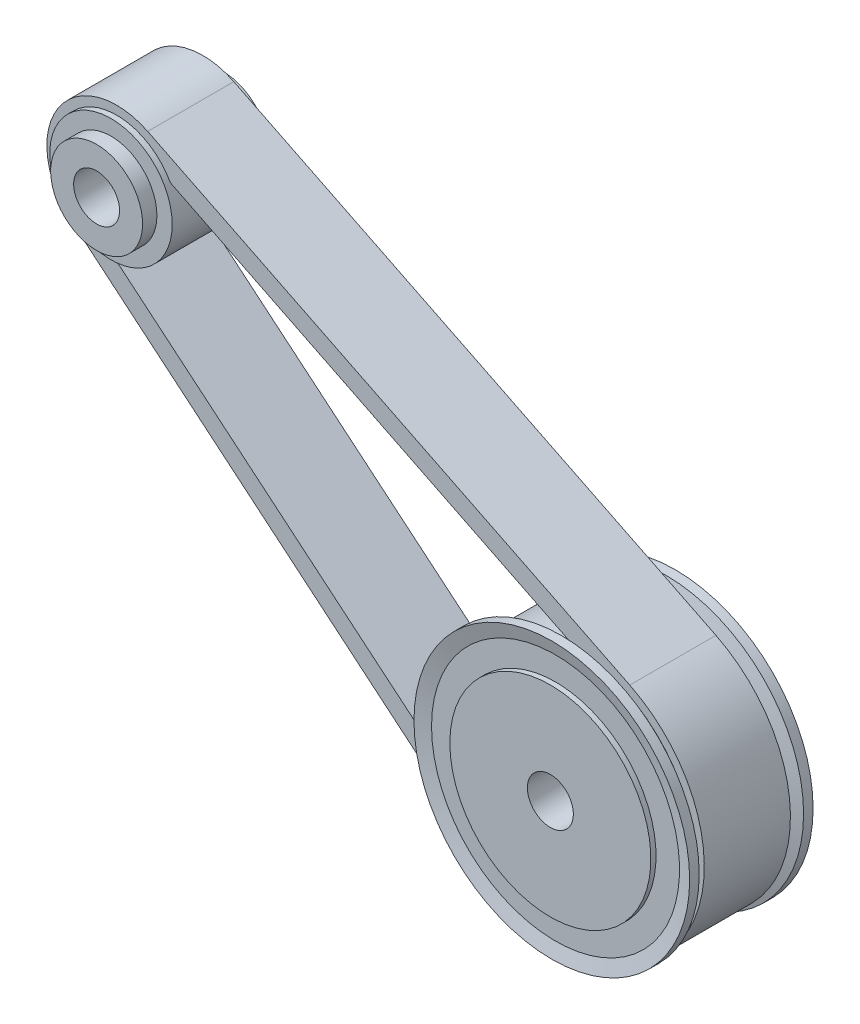
ISO-10303-21;
HEADER;
FILE_DESCRIPTION(('STEP AP214'),'2;1');
FILE_NAME('part.step','',(''),(''),'','','');
FILE_SCHEMA(('AUTOMOTIVE_DESIGN { 1 0 10303 214 1 1 1 1 }'));
ENDSEC;
DATA;
#1=APPLICATION_CONTEXT('core data for automotive mechanical design processes');
#2=APPLICATION_PROTOCOL_DEFINITION('international standard','automotive_design',2000,#1);
#3=PRODUCT_CONTEXT('',#1,'mechanical');
#4=PRODUCT('Part','Part','',(#3));
#5=PRODUCT_RELATED_PRODUCT_CATEGORY('part','',(#4));
#6=PRODUCT_DEFINITION_FORMATION('','',#4);
#7=PRODUCT_DEFINITION_CONTEXT('part definition',#1,'design');
#8=PRODUCT_DEFINITION('design','',#6,#7);
#9=PRODUCT_DEFINITION_SHAPE('','',#8);
#10=(LENGTH_UNIT() NAMED_UNIT(*) SI_UNIT(.MILLI.,.METRE.));
#11=(NAMED_UNIT(*) PLANE_ANGLE_UNIT() SI_UNIT($,.RADIAN.));
#12=(NAMED_UNIT(*) SI_UNIT($,.STERADIAN.) SOLID_ANGLE_UNIT());
#13=UNCERTAINTY_MEASURE_WITH_UNIT(LENGTH_MEASURE(1.E-05),#10,'distance_accuracy_value','');
#14=(GEOMETRIC_REPRESENTATION_CONTEXT(3) GLOBAL_UNCERTAINTY_ASSIGNED_CONTEXT((#13)) GLOBAL_UNIT_ASSIGNED_CONTEXT((#10,
#11,#12)) REPRESENTATION_CONTEXT('',''));
#15=CARTESIAN_POINT('',(0.,0.,0.));
#16=DIRECTION('',(0.,0.,1.));
#17=DIRECTION('',(1.,0.,0.));
#18=AXIS2_PLACEMENT_3D('',#15,#16,#17);
#19=CARTESIAN_POINT('',(-79.,51.5,-3.5));
#20=DIRECTION('',(0.,0.,1.));
#21=DIRECTION('',(1.,0.,0.));
#22=AXIS2_PLACEMENT_3D('',#19,#20,#21);
#23=PLANE('',#22);
#24=CARTESIAN_POINT('',(-79.,51.5,-3.5));
#25=DIRECTION('',(0.,0.,1.));
#26=DIRECTION('',(1.,0.,0.));
#27=AXIS2_PLACEMENT_3D('',#24,#25,#26);
#28=CIRCLE('',#27,12.16);
#29=CARTESIAN_POINT('',(-73.6091780465663,62.3997540644905,-3.5));
#30=VERTEX_POINT('',#29);
#31=CARTESIAN_POINT('',(-86.7974853442076,42.1691467535456,-3.5));
#32=VERTEX_POINT('',#31);
#33=EDGE_CURVE('E138',#30,#32,#28,.T.);
#34=ORIENTED_EDGE('',*,*,#33,.T.);
#35=DIRECTION('',(0.767339905136049,-0.641240571069703,0.));
#36=VECTOR('',#35,1.);
#37=CARTESIAN_POINT('',(-86.7974853442076,42.1691467535456,-3.5));
#38=LINE('',#37,#36);
#39=CARTESIAN_POINT('',(-14.9409053059241,-17.87901978967,-3.5));
#40=VERTEX_POINT('',#39);
#41=EDGE_CURVE('E141',#32,#40,#38,.T.);
#42=ORIENTED_EDGE('',*,*,#41,.T.);
#43=CARTESIAN_POINT('',(0.,0.,-3.5));
#44=DIRECTION('',(0.,0.,1.));
#45=DIRECTION('',(1.,0.,0.));
#46=AXIS2_PLACEMENT_3D('',#43,#44,#45);
#47=CIRCLE('',#46,23.3);
#48=CARTESIAN_POINT('',(10.3294532495892,20.8852195479136,-3.5));
#49=VERTEX_POINT('',#48);
#50=EDGE_CURVE('E143',#40,#49,#47,.T.);
#51=ORIENTED_EDGE('',*,*,#50,.T.);
#52=DIRECTION('',(-0.896361353987706,0.443324173802112,0.));
#53=VECTOR('',#52,1.);
#54=CARTESIAN_POINT('',(10.3294532495892,20.8852195479136,-3.5));
#55=LINE('',#54,#53);
#56=EDGE_CURVE('E145',#49,#30,#55,.T.);
#57=ORIENTED_EDGE('',*,*,#56,.T.);
#58=EDGE_LOOP('',(#34,#42,#51,#57));
#59=FACE_BOUND('',#58,.T.);
#60=DIRECTION('',(0.767339905136049,-0.641240571069703,0.));
#61=VECTOR('',#60,1.);
#62=CARTESIAN_POINT('',(-84.6108549968599,44.7857758300596,-3.5));
#63=LINE('',#62,#61);
#64=CARTESIAN_POINT('',(-79.9387000700333,40.8814105372456,-3.5));
#65=VERTEX_POINT('',#64);
#66=CARTESIAN_POINT('',(-19.6015916595124,-9.54031469154621,-3.5));
#67=VERTEX_POINT('',#66);
#68=EDGE_CURVE('E135',#65,#67,#63,.T.);
#69=ORIENTED_EDGE('',*,*,#68,.F.);
#70=CARTESIAN_POINT('',(-79.,51.5,-3.5));
#71=DIRECTION('',(0.,0.,1.));
#72=DIRECTION('',(1.,0.,0.));
#73=AXIS2_PLACEMENT_3D('',#70,#71,#72);
#74=CIRCLE('',#73,10.66);
#75=CARTESIAN_POINT('',(-69.6631768383774,56.6438636498829,-3.5));
#76=VERTEX_POINT('',#75);
#77=EDGE_CURVE('E55',#65,#76,#74,.F.);
#78=ORIENTED_EDGE('',*,*,#77,.T.);
#79=DIRECTION('',(-0.896361353987707,0.443324173802112,0.));
#80=VECTOR('',#79,1.);
#81=CARTESIAN_POINT('',(8.81771781692401,17.8286273308155,-3.5));
#82=LINE('',#81,#80);
#83=CARTESIAN_POINT('',(0.81908510128873,21.7846069415275,-3.5));
#84=VERTEX_POINT('',#83);
#85=EDGE_CURVE('E113',#84,#76,#82,.T.);
#86=ORIENTED_EDGE('',*,*,#85,.F.);
#87=CARTESIAN_POINT('',(0.,0.,-3.5));
#88=DIRECTION('',(0.,0.,1.));
#89=DIRECTION('',(1.,0.,0.));
#90=AXIS2_PLACEMENT_3D('',#87,#88,#89);
#91=CIRCLE('',#90,21.8);
#92=EDGE_CURVE('E41',#67,#84,#91,.T.);
#93=ORIENTED_EDGE('',*,*,#92,.F.);
#94=EDGE_LOOP('',(#69,#78,#86,#93));
#95=FACE_BOUND('',#94,.T.);
#96=ADVANCED_FACE('F33',(#59,#95),#23,.T.);
#97=CARTESIAN_POINT('',(-84.6108549968599,44.7857758300596,-3.5));
#98=DIRECTION('',(0.641240571069703,0.767339905136049,0.));
#99=DIRECTION('',(-0.767339905136049,0.641240571069703,0.));
#100=AXIS2_PLACEMENT_3D('',#97,#98,#99);
#101=PLANE('',#100);
#102=DIRECTION('',(0.767339905136049,-0.641240571069703,0.));
#103=VECTOR('',#102,1.);
#104=CARTESIAN_POINT('',(-84.6108549968599,44.7857758300596,-18.5));
#105=LINE('',#104,#103);
#106=CARTESIAN_POINT('',(-79.9387000700333,40.8814105372456,-18.5));
#107=VERTEX_POINT('',#106);
#108=CARTESIAN_POINT('',(-19.6015916595124,-9.54031469154621,-18.5));
#109=VERTEX_POINT('',#108);
#110=EDGE_CURVE('E108',#107,#109,#105,.T.);
#111=ORIENTED_EDGE('',*,*,#110,.F.);
#112=DIRECTION('',(0.,0.,1.));
#113=VECTOR('',#112,1.);
#114=CARTESIAN_POINT('',(-79.9387000700333,40.8814105372456,-50.));
#115=LINE('',#114,#113);
#116=EDGE_CURVE('E48',#107,#65,#115,.T.);
#117=ORIENTED_EDGE('',*,*,#116,.T.);
#118=ORIENTED_EDGE('',*,*,#68,.T.);
#119=DIRECTION('',(0.,0.,-1.));
#120=VECTOR('',#119,1.);
#121=CARTESIAN_POINT('',(-19.6015916595124,-9.54031469154621,50.));
#122=LINE('',#121,#120);
#123=EDGE_CURVE('E200',#109,#67,#122,.F.);
#124=ORIENTED_EDGE('',*,*,#123,.F.);
#125=EDGE_LOOP('',(#111,#117,#118,#124));
#126=FACE_BOUND('',#125,.T.);
#127=ADVANCED_FACE('F208',(#126),#101,.T.);
#128=CARTESIAN_POINT('',(8.81771781692401,17.8286273308155,-3.5));
#129=DIRECTION('',(-0.443324173802112,-0.896361353987706,0.));
#130=DIRECTION('',(0.896361353987707,-0.443324173802112,0.));
#131=AXIS2_PLACEMENT_3D('',#128,#129,#130);
#132=PLANE('',#131);
#133=ORIENTED_EDGE('',*,*,#85,.T.);
#134=DIRECTION('',(0.,0.,1.));
#135=VECTOR('',#134,1.);
#136=CARTESIAN_POINT('',(-69.6631768383773,56.6438636498829,-50.));
#137=LINE('',#136,#135);
#138=CARTESIAN_POINT('',(-69.6631768383773,56.6438636498829,-18.5));
#139=VERTEX_POINT('',#138);
#140=EDGE_CURVE('E111',#76,#139,#137,.F.);
#141=ORIENTED_EDGE('',*,*,#140,.T.);
#142=DIRECTION('',(-0.896361353987707,0.443324173802112,0.));
#143=VECTOR('',#142,1.);
#144=CARTESIAN_POINT('',(8.81771781692401,17.8286273308155,-18.5));
#145=LINE('',#144,#143);
#146=CARTESIAN_POINT('',(0.81908510128874,21.7846069415275,-18.5));
#147=VERTEX_POINT('',#146);
#148=EDGE_CURVE('E100',#147,#139,#145,.T.);
#149=ORIENTED_EDGE('',*,*,#148,.F.);
#150=DIRECTION('',(0.,0.,-1.));
#151=VECTOR('',#150,1.);
#152=CARTESIAN_POINT('',(0.81908510128873,21.7846069415275,50.));
#153=LINE('',#152,#151);
#154=EDGE_CURVE('E198',#84,#147,#153,.T.);
#155=ORIENTED_EDGE('',*,*,#154,.F.);
#156=EDGE_LOOP('',(#133,#141,#149,#155));
#157=FACE_BOUND('',#156,.T.);
#158=ADVANCED_FACE('F112',(#157),#132,.T.);
#159=CARTESIAN_POINT('',(-79.,51.5,-18.5));
#160=DIRECTION('',(0.,0.,1.));
#161=DIRECTION('',(1.,0.,0.));
#162=AXIS2_PLACEMENT_3D('',#159,#160,#161);
#163=PLANE('',#162);
#164=CARTESIAN_POINT('',(-79.,51.5,-18.5));
#165=DIRECTION('',(0.,0.,1.));
#166=DIRECTION('',(1.,0.,0.));
#167=AXIS2_PLACEMENT_3D('',#164,#165,#166);
#168=CIRCLE('',#167,12.16);
#169=CARTESIAN_POINT('',(-73.6091780465663,62.3997540644905,-18.5));
#170=VERTEX_POINT('',#169);
#171=CARTESIAN_POINT('',(-86.7974853442076,42.1691467535456,-18.5));
#172=VERTEX_POINT('',#171);
#173=EDGE_CURVE('E107',#170,#172,#168,.T.);
#174=ORIENTED_EDGE('',*,*,#173,.F.);
#175=DIRECTION('',(-0.896361353987706,0.443324173802112,0.));
#176=VECTOR('',#175,1.);
#177=CARTESIAN_POINT('',(10.3294532495892,20.8852195479136,-18.5));
#178=LINE('',#177,#176);
#179=CARTESIAN_POINT('',(10.3294532495892,20.8852195479136,-18.5));
#180=VERTEX_POINT('',#179);
#181=EDGE_CURVE('E132',#180,#170,#178,.T.);
#182=ORIENTED_EDGE('',*,*,#181,.F.);
#183=CARTESIAN_POINT('',(0.,0.,-18.5));
#184=DIRECTION('',(0.,0.,1.));
#185=DIRECTION('',(1.,0.,0.));
#186=AXIS2_PLACEMENT_3D('',#183,#184,#185);
#187=CIRCLE('',#186,23.3);
#188=CARTESIAN_POINT('',(-14.9409053059241,-17.87901978967,-18.5));
#189=VERTEX_POINT('',#188);
#190=EDGE_CURVE('E129',#189,#180,#187,.T.);
#191=ORIENTED_EDGE('',*,*,#190,.F.);
#192=DIRECTION('',(0.767339905136049,-0.641240571069703,0.));
#193=VECTOR('',#192,1.);
#194=CARTESIAN_POINT('',(-86.7974853442076,42.1691467535456,-18.5));
#195=LINE('',#194,#193);
#196=EDGE_CURVE('E126',#172,#189,#195,.T.);
#197=ORIENTED_EDGE('',*,*,#196,.F.);
#198=EDGE_LOOP('',(#174,#182,#191,#197));
#199=FACE_BOUND('',#198,.T.);
#200=CARTESIAN_POINT('',(-79.,51.5,-18.5));
#201=DIRECTION('',(0.,0.,1.));
#202=DIRECTION('',(1.,0.,0.));
#203=AXIS2_PLACEMENT_3D('',#200,#201,#202);
#204=CIRCLE('',#203,10.66);
#205=EDGE_CURVE('E11',#107,#139,#204,.F.);
#206=ORIENTED_EDGE('',*,*,#205,.F.);
#207=ORIENTED_EDGE('',*,*,#110,.T.);
#208=CARTESIAN_POINT('',(0.,0.,-18.5));
#209=DIRECTION('',(0.,0.,1.));
#210=DIRECTION('',(1.,0.,0.));
#211=AXIS2_PLACEMENT_3D('',#208,#209,#210);
#212=CIRCLE('',#211,21.8);
#213=EDGE_CURVE('E104',#109,#147,#212,.T.);
#214=ORIENTED_EDGE('',*,*,#213,.T.);
#215=ORIENTED_EDGE('',*,*,#148,.T.);
#216=EDGE_LOOP('',(#206,#207,#214,#215));
#217=FACE_BOUND('',#216,.T.);
#218=ADVANCED_FACE('F102',(#199,#217),#163,.F.);
#219=CARTESIAN_POINT('',(0.,0.,50.));
#220=DIRECTION('',(0.,0.,-1.));
#221=DIRECTION('',(-1.,0.,0.));
#222=AXIS2_PLACEMENT_3D('',#219,#220,#221);
#223=CYLINDRICAL_SURFACE('',#222,4.);
#224=CARTESIAN_POINT('',(0.,0.,0.));
#225=DIRECTION('',(0.,0.,-1.));
#226=DIRECTION('',(-1.,0.,0.));
#227=AXIS2_PLACEMENT_3D('',#224,#225,#226);
#228=CIRCLE('',#227,4.);
#229=CARTESIAN_POINT('',(-4.,0.,0.));
#230=VERTEX_POINT('',#229);
#231=EDGE_CURVE('E194',#230,#230,#228,.T.);
#232=ORIENTED_EDGE('',*,*,#231,.F.);
#233=EDGE_LOOP('',(#232));
#234=FACE_BOUND('',#233,.T.);
#235=CARTESIAN_POINT('',(0.,0.,-22.));
#236=DIRECTION('',(0.,0.,-1.));
#237=DIRECTION('',(-1.,0.,0.));
#238=AXIS2_PLACEMENT_3D('',#235,#236,#237);
#239=CIRCLE('',#238,4.);
#240=CARTESIAN_POINT('',(-4.,0.,-22.));
#241=VERTEX_POINT('',#240);
#242=EDGE_CURVE('E155',#241,#241,#239,.T.);
#243=ORIENTED_EDGE('',*,*,#242,.T.);
#244=EDGE_LOOP('',(#243));
#245=FACE_BOUND('',#244,.T.);
#246=ADVANCED_FACE('F35',(#234,#245),#223,.F.);
#247=CARTESIAN_POINT('',(4.,0.,0.));
#248=DIRECTION('',(0.,0.,-1.));
#249=DIRECTION('',(-1.,0.,0.));
#250=AXIS2_PLACEMENT_3D('',#247,#248,#249);
#251=PLANE('',#250);
#252=CARTESIAN_POINT('',(0.,0.,0.));
#253=DIRECTION('',(0.,0.,-1.));
#254=DIRECTION('',(-1.,0.,0.));
#255=AXIS2_PLACEMENT_3D('',#252,#253,#254);
#256=CIRCLE('',#255,17.5);
#257=CARTESIAN_POINT('',(-17.5,0.,0.));
#258=VERTEX_POINT('',#257);
#259=EDGE_CURVE('E191',#258,#258,#256,.T.);
#260=ORIENTED_EDGE('',*,*,#259,.F.);
#261=EDGE_LOOP('',(#260));
#262=FACE_BOUND('',#261,.T.);
#263=ORIENTED_EDGE('',*,*,#231,.T.);
#264=EDGE_LOOP('',(#263));
#265=FACE_BOUND('',#264,.T.);
#266=ADVANCED_FACE('F277',(#262,#265),#251,.F.);
#267=CARTESIAN_POINT('',(0.,0.,50.));
#268=DIRECTION('',(0.,0.,-1.));
#269=DIRECTION('',(-1.,0.,0.));
#270=AXIS2_PLACEMENT_3D('',#267,#268,#269);
#271=CYLINDRICAL_SURFACE('',#270,17.5);
#272=CARTESIAN_POINT('',(0.,0.,-0.899999999999998));
#273=DIRECTION('',(0.,0.,-1.));
#274=DIRECTION('',(-1.,0.,0.));
#275=AXIS2_PLACEMENT_3D('',#272,#273,#274);
#276=CIRCLE('',#275,17.5);
#277=CARTESIAN_POINT('',(-17.5,0.,-0.899999999999998));
#278=VERTEX_POINT('',#277);
#279=EDGE_CURVE('E188',#278,#278,#276,.T.);
#280=ORIENTED_EDGE('',*,*,#279,.F.);
#281=EDGE_LOOP('',(#280));
#282=FACE_BOUND('',#281,.T.);
#283=ORIENTED_EDGE('',*,*,#259,.T.);
#284=EDGE_LOOP('',(#283));
#285=FACE_BOUND('',#284,.T.);
#286=ADVANCED_FACE('F274',(#282,#285),#271,.T.);
#287=CARTESIAN_POINT('',(17.5,0.,-0.899999999999999));
#288=DIRECTION('',(0.,0.,-1.));
#289=DIRECTION('',(-1.,0.,0.));
#290=AXIS2_PLACEMENT_3D('',#287,#288,#289);
#291=PLANE('',#290);
#292=CARTESIAN_POINT('',(0.,0.,-0.899999999999998));
#293=DIRECTION('',(0.,0.,-1.));
#294=DIRECTION('',(-1.,0.,0.));
#295=AXIS2_PLACEMENT_3D('',#292,#293,#294);
#296=CIRCLE('',#295,21.5890951783105);
#297=CARTESIAN_POINT('',(-21.5890951783105,0.,-0.899999999999998));
#298=VERTEX_POINT('',#297);
#299=EDGE_CURVE('E185',#298,#298,#296,.T.);
#300=ORIENTED_EDGE('',*,*,#299,.F.);
#301=EDGE_LOOP('',(#300));
#302=FACE_BOUND('',#301,.T.);
#303=ORIENTED_EDGE('',*,*,#279,.T.);
#304=EDGE_LOOP('',(#303));
#305=FACE_BOUND('',#304,.T.);
#306=ADVANCED_FACE('F270',(#302,#305),#291,.F.);
#307=CARTESIAN_POINT('',(0.,0.,-0.899999999999998));
#308=DIRECTION('',(0.,0.,1.));
#309=DIRECTION('',(1.,0.,0.));
#310=AXIS2_PLACEMENT_3D('',#307,#308,#309);
#311=CONICAL_SURFACE('',#310,21.5890951783105,1.30899693899575);
#312=CARTESIAN_POINT('',(0.,0.,-0.253999999999997));
#313=DIRECTION('',(0.,0.,-1.));
#314=DIRECTION('',(-1.,0.,0.));
#315=AXIS2_PLACEMENT_3D('',#312,#313,#314);
#316=CIRCLE('',#315,24.);
#317=CARTESIAN_POINT('',(-24.,0.,-0.253999999999997));
#318=VERTEX_POINT('',#317);
#319=EDGE_CURVE('E182',#318,#318,#316,.T.);
#320=ORIENTED_EDGE('',*,*,#319,.F.);
#321=EDGE_LOOP('',(#320));
#322=FACE_BOUND('',#321,.T.);
#323=ORIENTED_EDGE('',*,*,#299,.T.);
#324=EDGE_LOOP('',(#323));
#325=FACE_BOUND('',#324,.T.);
#326=ADVANCED_FACE('F266',(#322,#325),#311,.F.);
#327=CARTESIAN_POINT('',(0.,0.,50.));
#328=DIRECTION('',(0.,0.,-1.));
#329=DIRECTION('',(-1.,0.,0.));
#330=AXIS2_PLACEMENT_3D('',#327,#328,#329);
#331=CYLINDRICAL_SURFACE('',#330,24.);
#332=CARTESIAN_POINT('',(0.,0.,-1.91044188865613));
#333=DIRECTION('',(0.,0.,-1.));
#334=DIRECTION('',(-1.,0.,0.));
#335=AXIS2_PLACEMENT_3D('',#332,#333,#334);
#336=CIRCLE('',#335,24.);
#337=CARTESIAN_POINT('',(-24.,0.,-1.91044188865613));
#338=VERTEX_POINT('',#337);
#339=EDGE_CURVE('E179',#338,#338,#336,.T.);
#340=ORIENTED_EDGE('',*,*,#339,.F.);
#341=EDGE_LOOP('',(#340));
#342=FACE_BOUND('',#341,.T.);
#343=ORIENTED_EDGE('',*,*,#319,.T.);
#344=EDGE_LOOP('',(#343));
#345=FACE_BOUND('',#344,.T.);
#346=ADVANCED_FACE('F262',(#342,#345),#331,.T.);
#347=CARTESIAN_POINT('',(0.,0.,-1.91044188865613));
#348=DIRECTION('',(0.,0.,1.));
#349=DIRECTION('',(1.,0.,0.));
#350=AXIS2_PLACEMENT_3D('',#347,#348,#349);
#351=CONICAL_SURFACE('',#350,24.,1.30899693899575);
#352=CARTESIAN_POINT('',(0.,0.,-2.4999301120046));
#353=DIRECTION('',(0.,0.,-1.));
#354=DIRECTION('',(-1.,0.,0.));
#355=AXIS2_PLACEMENT_3D('',#352,#353,#354);
#356=CIRCLE('',#355,21.8);
#357=CARTESIAN_POINT('',(-21.8,0.,-2.4999301120046));
#358=VERTEX_POINT('',#357);
#359=EDGE_CURVE('E176',#358,#358,#356,.T.);
#360=ORIENTED_EDGE('',*,*,#359,.F.);
#361=EDGE_LOOP('',(#360));
#362=FACE_BOUND('',#361,.T.);
#363=ORIENTED_EDGE('',*,*,#339,.T.);
#364=EDGE_LOOP('',(#363));
#365=FACE_BOUND('',#364,.T.);
#366=ADVANCED_FACE('F259',(#362,#365),#351,.T.);
#367=CARTESIAN_POINT('',(0.,0.,50.));
#368=DIRECTION('',(0.,0.,-1.));
#369=DIRECTION('',(-1.,0.,0.));
#370=AXIS2_PLACEMENT_3D('',#367,#368,#369);
#371=CYLINDRICAL_SURFACE('',#370,21.8);
#372=ORIENTED_EDGE('',*,*,#123,.T.);
#373=ORIENTED_EDGE('',*,*,#92,.T.);
#374=ORIENTED_EDGE('',*,*,#154,.T.);
#375=ORIENTED_EDGE('',*,*,#213,.F.);
#376=EDGE_LOOP('',(#372,#373,#374,#375));
#377=FACE_BOUND('',#376,.T.);
#378=CARTESIAN_POINT('',(0.,0.,-19.5000698879954));
#379=DIRECTION('',(0.,0.,-1.));
#380=DIRECTION('',(-1.,0.,0.));
#381=AXIS2_PLACEMENT_3D('',#378,#379,#380);
#382=CIRCLE('',#381,21.8);
#383=CARTESIAN_POINT('',(-21.8,0.,-19.5000698879954));
#384=VERTEX_POINT('',#383);
#385=EDGE_CURVE('E173',#384,#384,#382,.T.);
#386=ORIENTED_EDGE('',*,*,#385,.F.);
#387=EDGE_LOOP('',(#386));
#388=FACE_BOUND('',#387,.T.);
#389=ORIENTED_EDGE('',*,*,#359,.T.);
#390=EDGE_LOOP('',(#389));
#391=FACE_BOUND('',#390,.T.);
#392=ADVANCED_FACE('F204',(#377,#388,#391),#371,.T.);
#393=CARTESIAN_POINT('',(0.,0.,-19.5000698879954));
#394=DIRECTION('',(0.,0.,-1.));
#395=DIRECTION('',(-1.,0.,0.));
#396=AXIS2_PLACEMENT_3D('',#393,#394,#395);
#397=CONICAL_SURFACE('',#396,21.8,1.30899693899574);
#398=CARTESIAN_POINT('',(0.,0.,-20.0895581113439));
#399=DIRECTION('',(0.,0.,-1.));
#400=DIRECTION('',(-1.,0.,0.));
#401=AXIS2_PLACEMENT_3D('',#398,#399,#400);
#402=CIRCLE('',#401,24.);
#403=CARTESIAN_POINT('',(-24.,0.,-20.0895581113439));
#404=VERTEX_POINT('',#403);
#405=EDGE_CURVE('E170',#404,#404,#402,.T.);
#406=ORIENTED_EDGE('',*,*,#405,.F.);
#407=EDGE_LOOP('',(#406));
#408=FACE_BOUND('',#407,.T.);
#409=ORIENTED_EDGE('',*,*,#385,.T.);
#410=EDGE_LOOP('',(#409));
#411=FACE_BOUND('',#410,.T.);
#412=ADVANCED_FACE('F252',(#408,#411),#397,.T.);
#413=CARTESIAN_POINT('',(0.,0.,50.));
#414=DIRECTION('',(0.,0.,-1.));
#415=DIRECTION('',(-1.,0.,0.));
#416=AXIS2_PLACEMENT_3D('',#413,#414,#415);
#417=CYLINDRICAL_SURFACE('',#416,24.);
#418=CARTESIAN_POINT('',(0.,0.,-21.746));
#419=DIRECTION('',(0.,0.,-1.));
#420=DIRECTION('',(-1.,0.,0.));
#421=AXIS2_PLACEMENT_3D('',#418,#419,#420);
#422=CIRCLE('',#421,24.);
#423=CARTESIAN_POINT('',(-24.,0.,-21.746));
#424=VERTEX_POINT('',#423);
#425=EDGE_CURVE('E167',#424,#424,#422,.T.);
#426=ORIENTED_EDGE('',*,*,#425,.F.);
#427=EDGE_LOOP('',(#426));
#428=FACE_BOUND('',#427,.T.);
#429=ORIENTED_EDGE('',*,*,#405,.T.);
#430=EDGE_LOOP('',(#429));
#431=FACE_BOUND('',#430,.T.);
#432=ADVANCED_FACE('F248',(#428,#431),#417,.T.);
#433=CARTESIAN_POINT('',(0.,0.,-21.746));
#434=DIRECTION('',(0.,0.,-1.));
#435=DIRECTION('',(-1.,0.,0.));
#436=AXIS2_PLACEMENT_3D('',#433,#434,#435);
#437=CONICAL_SURFACE('',#436,24.,1.30899693899574);
#438=CARTESIAN_POINT('',(0.,0.,-21.1));
#439=DIRECTION('',(0.,0.,-1.));
#440=DIRECTION('',(-1.,0.,0.));
#441=AXIS2_PLACEMENT_3D('',#438,#439,#440);
#442=CIRCLE('',#441,21.5890951783105);
#443=CARTESIAN_POINT('',(-21.5890951783105,0.,-21.1));
#444=VERTEX_POINT('',#443);
#445=EDGE_CURVE('E164',#444,#444,#442,.T.);
#446=ORIENTED_EDGE('',*,*,#445,.F.);
#447=EDGE_LOOP('',(#446));
#448=FACE_BOUND('',#447,.T.);
#449=ORIENTED_EDGE('',*,*,#425,.T.);
#450=EDGE_LOOP('',(#449));
#451=FACE_BOUND('',#450,.T.);
#452=ADVANCED_FACE('F244',(#448,#451),#437,.F.);
#453=CARTESIAN_POINT('',(21.5890951783105,0.,-21.1));
#454=DIRECTION('',(0.,0.,1.));
#455=DIRECTION('',(1.,0.,0.));
#456=AXIS2_PLACEMENT_3D('',#453,#454,#455);
#457=PLANE('',#456);
#458=CARTESIAN_POINT('',(0.,0.,-21.1));
#459=DIRECTION('',(0.,0.,-1.));
#460=DIRECTION('',(-1.,0.,0.));
#461=AXIS2_PLACEMENT_3D('',#458,#459,#460);
#462=CIRCLE('',#461,17.5);
#463=CARTESIAN_POINT('',(-17.5,0.,-21.1));
#464=VERTEX_POINT('',#463);
#465=EDGE_CURVE('E161',#464,#464,#462,.T.);
#466=ORIENTED_EDGE('',*,*,#465,.F.);
#467=EDGE_LOOP('',(#466));
#468=FACE_BOUND('',#467,.T.);
#469=ORIENTED_EDGE('',*,*,#445,.T.);
#470=EDGE_LOOP('',(#469));
#471=FACE_BOUND('',#470,.T.);
#472=ADVANCED_FACE('F240',(#468,#471),#457,.F.);
#473=CARTESIAN_POINT('',(0.,0.,50.));
#474=DIRECTION('',(0.,0.,-1.));
#475=DIRECTION('',(-1.,0.,0.));
#476=AXIS2_PLACEMENT_3D('',#473,#474,#475);
#477=CYLINDRICAL_SURFACE('',#476,17.5);
#478=CARTESIAN_POINT('',(0.,0.,-22.));
#479=DIRECTION('',(0.,0.,-1.));
#480=DIRECTION('',(-1.,0.,0.));
#481=AXIS2_PLACEMENT_3D('',#478,#479,#480);
#482=CIRCLE('',#481,17.5);
#483=CARTESIAN_POINT('',(-17.5,0.,-22.));
#484=VERTEX_POINT('',#483);
#485=EDGE_CURVE('E158',#484,#484,#482,.T.);
#486=ORIENTED_EDGE('',*,*,#485,.F.);
#487=EDGE_LOOP('',(#486));
#488=FACE_BOUND('',#487,.T.);
#489=ORIENTED_EDGE('',*,*,#465,.T.);
#490=EDGE_LOOP('',(#489));
#491=FACE_BOUND('',#490,.T.);
#492=ADVANCED_FACE('F236',(#488,#491),#477,.T.);
#493=CARTESIAN_POINT('',(17.5,0.,-22.));
#494=DIRECTION('',(0.,0.,1.));
#495=DIRECTION('',(1.,0.,0.));
#496=AXIS2_PLACEMENT_3D('',#493,#494,#495);
#497=PLANE('',#496);
#498=ORIENTED_EDGE('',*,*,#242,.F.);
#499=EDGE_LOOP('',(#498));
#500=FACE_BOUND('',#499,.T.);
#501=ORIENTED_EDGE('',*,*,#485,.T.);
#502=EDGE_LOOP('',(#501));
#503=FACE_BOUND('',#502,.T.);
#504=ADVANCED_FACE('F232',(#500,#503),#497,.F.);
#505=CARTESIAN_POINT('',(-79.,51.5,-3.5));
#506=DIRECTION('',(0.,0.,-1.));
#507=DIRECTION('',(-1.,0.,0.));
#508=AXIS2_PLACEMENT_3D('',#505,#506,#507);
#509=CYLINDRICAL_SURFACE('',#508,12.16);
#510=DIRECTION('',(0.,0.,-1.));
#511=VECTOR('',#510,1.);
#512=CARTESIAN_POINT('',(-73.6091780465663,62.3997540644905,-3.5));
#513=LINE('',#512,#511);
#514=EDGE_CURVE('E147',#30,#170,#513,.T.);
#515=ORIENTED_EDGE('',*,*,#514,.T.);
#516=ORIENTED_EDGE('',*,*,#173,.T.);
#517=DIRECTION('',(0.,0.,-1.));
#518=VECTOR('',#517,1.);
#519=CARTESIAN_POINT('',(-86.7974853442076,42.1691467535456,-3.5));
#520=LINE('',#519,#518);
#521=EDGE_CURVE('E153',#32,#172,#520,.T.);
#522=ORIENTED_EDGE('',*,*,#521,.F.);
#523=ORIENTED_EDGE('',*,*,#33,.F.);
#524=EDGE_LOOP('',(#515,#516,#522,#523));
#525=FACE_BOUND('',#524,.T.);
#526=ADVANCED_FACE('F228',(#525),#509,.T.);
#527=CARTESIAN_POINT('',(-86.7974853442076,42.1691467535456,-3.5));
#528=DIRECTION('',(0.641240571069703,0.767339905136049,0.));
#529=DIRECTION('',(-0.767339905136049,0.641240571069703,0.));
#530=AXIS2_PLACEMENT_3D('',#527,#528,#529);
#531=PLANE('',#530);
#532=ORIENTED_EDGE('',*,*,#521,.T.);
#533=ORIENTED_EDGE('',*,*,#196,.T.);
#534=DIRECTION('',(0.,0.,-1.));
#535=VECTOR('',#534,1.);
#536=CARTESIAN_POINT('',(-14.9409053059241,-17.87901978967,-3.5));
#537=LINE('',#536,#535);
#538=EDGE_CURVE('E151',#40,#189,#537,.T.);
#539=ORIENTED_EDGE('',*,*,#538,.F.);
#540=ORIENTED_EDGE('',*,*,#41,.F.);
#541=EDGE_LOOP('',(#532,#533,#539,#540));
#542=FACE_BOUND('',#541,.T.);
#543=ADVANCED_FACE('F224',(#542),#531,.F.);
#544=CARTESIAN_POINT('',(0.,0.,-3.5));
#545=DIRECTION('',(0.,0.,-1.));
#546=DIRECTION('',(-1.,0.,0.));
#547=AXIS2_PLACEMENT_3D('',#544,#545,#546);
#548=CYLINDRICAL_SURFACE('',#547,23.3);
#549=ORIENTED_EDGE('',*,*,#538,.T.);
#550=ORIENTED_EDGE('',*,*,#190,.T.);
#551=DIRECTION('',(0.,0.,-1.));
#552=VECTOR('',#551,1.);
#553=CARTESIAN_POINT('',(10.3294532495892,20.8852195479136,-3.5));
#554=LINE('',#553,#552);
#555=EDGE_CURVE('E149',#49,#180,#554,.T.);
#556=ORIENTED_EDGE('',*,*,#555,.F.);
#557=ORIENTED_EDGE('',*,*,#50,.F.);
#558=EDGE_LOOP('',(#549,#550,#556,#557));
#559=FACE_BOUND('',#558,.T.);
#560=ADVANCED_FACE('F220',(#559),#548,.T.);
#561=CARTESIAN_POINT('',(10.3294532495892,20.8852195479136,-3.5));
#562=DIRECTION('',(-0.443324173802112,-0.896361353987706,0.));
#563=DIRECTION('',(0.896361353987706,-0.443324173802112,0.));
#564=AXIS2_PLACEMENT_3D('',#561,#562,#563);
#565=PLANE('',#564);
#566=ORIENTED_EDGE('',*,*,#555,.T.);
#567=ORIENTED_EDGE('',*,*,#181,.T.);
#568=ORIENTED_EDGE('',*,*,#514,.F.);
#569=ORIENTED_EDGE('',*,*,#56,.F.);
#570=EDGE_LOOP('',(#566,#567,#568,#569));
#571=FACE_BOUND('',#570,.T.);
#572=ADVANCED_FACE('F217',(#571),#565,.F.);
#573=CARTESIAN_POINT('',(-79.,51.5,-50.));
#574=DIRECTION('',(0.,0.,1.));
#575=DIRECTION('',(1.,0.,0.));
#576=AXIS2_PLACEMENT_3D('',#573,#574,#575);
#577=CYLINDRICAL_SURFACE('',#576,10.66);
#578=ORIENTED_EDGE('',*,*,#77,.F.);
#579=ORIENTED_EDGE('',*,*,#116,.F.);
#580=ORIENTED_EDGE('',*,*,#205,.T.);
#581=ORIENTED_EDGE('',*,*,#140,.F.);
#582=EDGE_LOOP('',(#578,#579,#580,#581));
#583=FACE_BOUND('',#582,.T.);
#584=CARTESIAN_POINT('',(-79.,51.5,-2.5));
#585=DIRECTION('',(0.,0.,1.));
#586=DIRECTION('',(1.,0.,0.));
#587=AXIS2_PLACEMENT_3D('',#584,#585,#586);
#588=CIRCLE('',#587,10.66);
#589=CARTESIAN_POINT('',(-68.34,51.5,-2.5));
#590=VERTEX_POINT('',#589);
#591=EDGE_CURVE('E115',#590,#590,#588,.T.);
#592=ORIENTED_EDGE('',*,*,#591,.F.);
#593=EDGE_LOOP('',(#592));
#594=FACE_BOUND('',#593,.T.);
#595=CARTESIAN_POINT('',(-79.,51.5,-19.5));
#596=DIRECTION('',(0.,0.,1.));
#597=DIRECTION('',(1.,0.,0.));
#598=AXIS2_PLACEMENT_3D('',#595,#596,#597);
#599=CIRCLE('',#598,10.66);
#600=CARTESIAN_POINT('',(-68.34,51.5,-19.5));
#601=VERTEX_POINT('',#600);
#602=EDGE_CURVE('E357',#601,#601,#599,.T.);
#603=ORIENTED_EDGE('',*,*,#602,.T.);
#604=EDGE_LOOP('',(#603));
#605=FACE_BOUND('',#604,.T.);
#606=ADVANCED_FACE('F117',(#583,#594,#605),#577,.T.);
#607=CARTESIAN_POINT('',(-89.66,51.5,-2.5));
#608=DIRECTION('',(0.,0.,-1.));
#609=DIRECTION('',(-1.,0.,0.));
#610=AXIS2_PLACEMENT_3D('',#607,#608,#609);
#611=PLANE('',#610);
#612=CARTESIAN_POINT('',(-79.,51.5,-2.5));
#613=DIRECTION('',(0.,0.,1.));
#614=DIRECTION('',(1.,0.,0.));
#615=AXIS2_PLACEMENT_3D('',#612,#613,#614);
#616=CIRCLE('',#615,8.00000000000001);
#617=CARTESIAN_POINT('',(-71.,51.5,-2.5));
#618=VERTEX_POINT('',#617);
#619=EDGE_CURVE('E376',#618,#618,#616,.T.);
#620=ORIENTED_EDGE('',*,*,#619,.F.);
#621=EDGE_LOOP('',(#620));
#622=FACE_BOUND('',#621,.T.);
#623=ORIENTED_EDGE('',*,*,#591,.T.);
#624=EDGE_LOOP('',(#623));
#625=FACE_BOUND('',#624,.T.);
#626=ADVANCED_FACE('F325',(#622,#625),#611,.F.);
#627=CARTESIAN_POINT('',(-79.,51.5,-50.));
#628=DIRECTION('',(0.,0.,1.));
#629=DIRECTION('',(1.,0.,0.));
#630=AXIS2_PLACEMENT_3D('',#627,#628,#629);
#631=CYLINDRICAL_SURFACE('',#630,8.00000000000001);
#632=CARTESIAN_POINT('',(-79.,51.5,0.));
#633=DIRECTION('',(0.,0.,1.));
#634=DIRECTION('',(1.,0.,0.));
#635=AXIS2_PLACEMENT_3D('',#632,#633,#634);
#636=CIRCLE('',#635,8.00000000000001);
#637=CARTESIAN_POINT('',(-71.,51.5,0.));
#638=VERTEX_POINT('',#637);
#639=EDGE_CURVE('E373',#638,#638,#636,.T.);
#640=ORIENTED_EDGE('',*,*,#639,.F.);
#641=EDGE_LOOP('',(#640));
#642=FACE_BOUND('',#641,.T.);
#643=ORIENTED_EDGE('',*,*,#619,.T.);
#644=EDGE_LOOP('',(#643));
#645=FACE_BOUND('',#644,.T.);
#646=ADVANCED_FACE('F328',(#642,#645),#631,.T.);
#647=CARTESIAN_POINT('',(-87.,51.5,0.));
#648=DIRECTION('',(0.,0.,-1.));
#649=DIRECTION('',(-1.,0.,0.));
#650=AXIS2_PLACEMENT_3D('',#647,#648,#649);
#651=PLANE('',#650);
#652=CARTESIAN_POINT('',(-79.,51.5,0.));
#653=DIRECTION('',(0.,0.,1.));
#654=DIRECTION('',(1.,0.,0.));
#655=AXIS2_PLACEMENT_3D('',#652,#653,#654);
#656=CIRCLE('',#655,4.);
#657=CARTESIAN_POINT('',(-75.,51.5,0.));
#658=VERTEX_POINT('',#657);
#659=EDGE_CURVE('E370',#658,#658,#656,.T.);
#660=ORIENTED_EDGE('',*,*,#659,.F.);
#661=EDGE_LOOP('',(#660));
#662=FACE_BOUND('',#661,.T.);
#663=ORIENTED_EDGE('',*,*,#639,.T.);
#664=EDGE_LOOP('',(#663));
#665=FACE_BOUND('',#664,.T.);
#666=ADVANCED_FACE('F332',(#662,#665),#651,.F.);
#667=CARTESIAN_POINT('',(-79.,51.5,-50.));
#668=DIRECTION('',(0.,0.,1.));
#669=DIRECTION('',(1.,0.,0.));
#670=AXIS2_PLACEMENT_3D('',#667,#668,#669);
#671=CYLINDRICAL_SURFACE('',#670,4.);
#672=CARTESIAN_POINT('',(-79.,51.5,-22.));
#673=DIRECTION('',(0.,0.,1.));
#674=DIRECTION('',(1.,0.,0.));
#675=AXIS2_PLACEMENT_3D('',#672,#673,#674);
#676=CIRCLE('',#675,4.);
#677=CARTESIAN_POINT('',(-75.,51.5,-22.));
#678=VERTEX_POINT('',#677);
#679=EDGE_CURVE('E364',#678,#678,#676,.T.);
#680=ORIENTED_EDGE('',*,*,#679,.F.);
#681=EDGE_LOOP('',(#680));
#682=FACE_BOUND('',#681,.T.);
#683=ORIENTED_EDGE('',*,*,#659,.T.);
#684=EDGE_LOOP('',(#683));
#685=FACE_BOUND('',#684,.T.);
#686=ADVANCED_FACE('F336',(#682,#685),#671,.F.);
#687=CARTESIAN_POINT('',(-83.,51.5,-22.));
#688=DIRECTION('',(0.,0.,1.));
#689=DIRECTION('',(1.,0.,0.));
#690=AXIS2_PLACEMENT_3D('',#687,#688,#689);
#691=PLANE('',#690);
#692=CARTESIAN_POINT('',(-79.,51.5,-22.));
#693=DIRECTION('',(0.,0.,1.));
#694=DIRECTION('',(1.,0.,0.));
#695=AXIS2_PLACEMENT_3D('',#692,#693,#694);
#696=CIRCLE('',#695,8.00000000000001);
#697=CARTESIAN_POINT('',(-71.,51.5,-22.));
#698=VERTEX_POINT('',#697);
#699=EDGE_CURVE('E361',#698,#698,#696,.T.);
#700=ORIENTED_EDGE('',*,*,#699,.F.);
#701=EDGE_LOOP('',(#700));
#702=FACE_BOUND('',#701,.T.);
#703=ORIENTED_EDGE('',*,*,#679,.T.);
#704=EDGE_LOOP('',(#703));
#705=FACE_BOUND('',#704,.T.);
#706=ADVANCED_FACE('F340',(#702,#705),#691,.F.);
#707=CARTESIAN_POINT('',(-79.,51.5,-50.));
#708=DIRECTION('',(0.,0.,1.));
#709=DIRECTION('',(1.,0.,0.));
#710=AXIS2_PLACEMENT_3D('',#707,#708,#709);
#711=CYLINDRICAL_SURFACE('',#710,8.00000000000001);
#712=CARTESIAN_POINT('',(-79.,51.5,-19.5));
#713=DIRECTION('',(0.,0.,1.));
#714=DIRECTION('',(1.,0.,0.));
#715=AXIS2_PLACEMENT_3D('',#712,#713,#714);
#716=CIRCLE('',#715,8.00000000000001);
#717=CARTESIAN_POINT('',(-71.,51.5,-19.5));
#718=VERTEX_POINT('',#717);
#719=EDGE_CURVE('E360',#718,#718,#716,.T.);
#720=ORIENTED_EDGE('',*,*,#719,.F.);
#721=EDGE_LOOP('',(#720));
#722=FACE_BOUND('',#721,.T.);
#723=ORIENTED_EDGE('',*,*,#699,.T.);
#724=EDGE_LOOP('',(#723));
#725=FACE_BOUND('',#724,.T.);
#726=ADVANCED_FACE('F344',(#722,#725),#711,.T.);
#727=CARTESIAN_POINT('',(-87.,51.5,-19.5));
#728=DIRECTION('',(0.,0.,1.));
#729=DIRECTION('',(1.,0.,0.));
#730=AXIS2_PLACEMENT_3D('',#727,#728,#729);
#731=PLANE('',#730);
#732=ORIENTED_EDGE('',*,*,#602,.F.);
#733=EDGE_LOOP('',(#732));
#734=FACE_BOUND('',#733,.T.);
#735=ORIENTED_EDGE('',*,*,#719,.T.);
#736=EDGE_LOOP('',(#735));
#737=FACE_BOUND('',#736,.T.);
#738=ADVANCED_FACE('F348',(#734,#737),#731,.F.);
#739=CLOSED_SHELL('',(#96,#127,#158,#218,#246,#266,#286,#306,#326,#346,#366,#392,#412,#432,#452,
#472,#492,#504,#526,#543,#560,#572,#606,#626,#646,#666,#686,#706,#726,#738));
#740=MANIFOLD_SOLID_BREP('B2',#739);
#741=ADVANCED_BREP_SHAPE_REPRESENTATION('',(#18,#740),#14);
#742=SHAPE_DEFINITION_REPRESENTATION(#9,#741);
ENDSEC;
END-ISO-10303-21;
